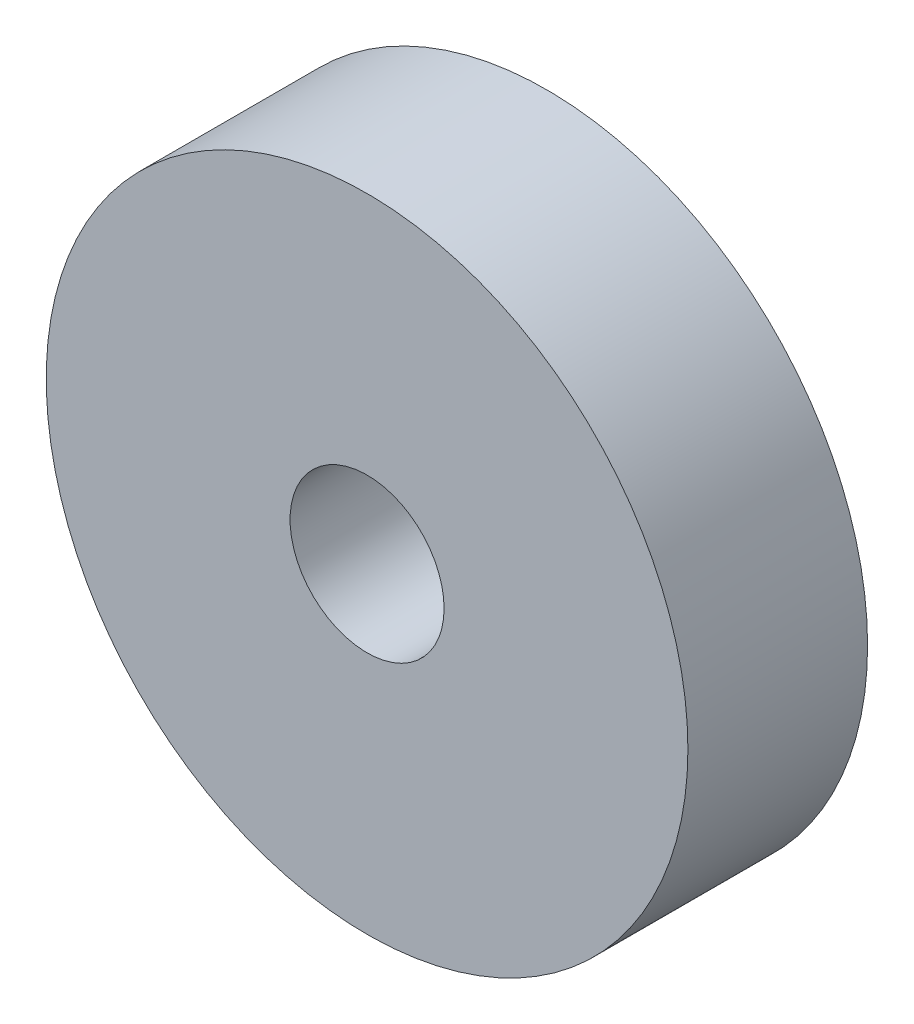
ISO-10303-21;
HEADER;
FILE_DESCRIPTION(('STEP AP214'),'2;1');
FILE_NAME('part.step','',(''),(''),'','','');
FILE_SCHEMA(('AUTOMOTIVE_DESIGN { 1 0 10303 214 1 1 1 1 }'));
ENDSEC;
DATA;
#1=APPLICATION_CONTEXT('core data for automotive mechanical design processes');
#2=APPLICATION_PROTOCOL_DEFINITION('international standard','automotive_design',2000,#1);
#3=PRODUCT_CONTEXT('',#1,'mechanical');
#4=PRODUCT('Part','Part','',(#3));
#5=PRODUCT_RELATED_PRODUCT_CATEGORY('part','',(#4));
#6=PRODUCT_DEFINITION_FORMATION('','',#4);
#7=PRODUCT_DEFINITION_CONTEXT('part definition',#1,'design');
#8=PRODUCT_DEFINITION('design','',#6,#7);
#9=PRODUCT_DEFINITION_SHAPE('','',#8);
#10=(LENGTH_UNIT() NAMED_UNIT(*) SI_UNIT(.MILLI.,.METRE.));
#11=(NAMED_UNIT(*) PLANE_ANGLE_UNIT() SI_UNIT($,.RADIAN.));
#12=(NAMED_UNIT(*) SI_UNIT($,.STERADIAN.) SOLID_ANGLE_UNIT());
#13=UNCERTAINTY_MEASURE_WITH_UNIT(LENGTH_MEASURE(1.E-05),#10,'distance_accuracy_value','');
#14=(GEOMETRIC_REPRESENTATION_CONTEXT(3) GLOBAL_UNCERTAINTY_ASSIGNED_CONTEXT((#13)) GLOBAL_UNIT_ASSIGNED_CONTEXT((#10,
#11,#12)) REPRESENTATION_CONTEXT('',''));
#15=CARTESIAN_POINT('',(0.,0.,0.));
#16=DIRECTION('',(0.,0.,1.));
#17=DIRECTION('',(1.,0.,0.));
#18=AXIS2_PLACEMENT_3D('',#15,#16,#17);
#19=CARTESIAN_POINT('',(0.,0.,7.));
#20=DIRECTION('',(0.,0.,-1.));
#21=DIRECTION('',(-1.,0.,0.));
#22=AXIS2_PLACEMENT_3D('',#19,#20,#21);
#23=CYLINDRICAL_SURFACE('',#22,12.5);
#24=CARTESIAN_POINT('',(0.,0.,7.));
#25=DIRECTION('',(0.,0.,1.));
#26=DIRECTION('',(1.,0.,0.));
#27=AXIS2_PLACEMENT_3D('',#24,#25,#26);
#28=CIRCLE('',#27,12.5);
#29=CARTESIAN_POINT('',(12.5,0.,7.));
#30=VERTEX_POINT('',#29);
#31=EDGE_CURVE('E10',#30,#30,#28,.T.);
#32=ORIENTED_EDGE('',*,*,#31,.F.);
#33=EDGE_LOOP('',(#32));
#34=FACE_BOUND('',#33,.T.);
#35=CARTESIAN_POINT('',(0.,0.,0.));
#36=DIRECTION('',(0.,0.,1.));
#37=DIRECTION('',(1.,0.,0.));
#38=AXIS2_PLACEMENT_3D('',#35,#36,#37);
#39=CIRCLE('',#38,12.5);
#40=CARTESIAN_POINT('',(12.5,0.,0.));
#41=VERTEX_POINT('',#40);
#42=EDGE_CURVE('E38',#41,#41,#39,.T.);
#43=ORIENTED_EDGE('',*,*,#42,.T.);
#44=EDGE_LOOP('',(#43));
#45=FACE_BOUND('',#44,.T.);
#46=ADVANCED_FACE('F35',(#34,#45),#23,.T.);
#47=CARTESIAN_POINT('',(0.,0.,7.));
#48=DIRECTION('',(0.,0.,1.));
#49=DIRECTION('',(1.,0.,0.));
#50=AXIS2_PLACEMENT_3D('',#47,#48,#49);
#51=PLANE('',#50);
#52=CARTESIAN_POINT('',(0.,0.,7.));
#53=DIRECTION('',(0.,0.,1.));
#54=DIRECTION('',(1.,0.,0.));
#55=AXIS2_PLACEMENT_3D('',#52,#53,#54);
#56=CIRCLE('',#55,3.);
#57=CARTESIAN_POINT('',(3.,0.,7.));
#58=VERTEX_POINT('',#57);
#59=EDGE_CURVE('E47',#58,#58,#56,.T.);
#60=ORIENTED_EDGE('',*,*,#59,.F.);
#61=EDGE_LOOP('',(#60));
#62=FACE_BOUND('',#61,.T.);
#63=ORIENTED_EDGE('',*,*,#31,.T.);
#64=EDGE_LOOP('',(#63));
#65=FACE_BOUND('',#64,.T.);
#66=ADVANCED_FACE('F62',(#62,#65),#51,.T.);
#67=CARTESIAN_POINT('',(0.,0.,0.));
#68=DIRECTION('',(0.,0.,1.));
#69=DIRECTION('',(1.,0.,0.));
#70=AXIS2_PLACEMENT_3D('',#67,#68,#69);
#71=PLANE('',#70);
#72=CARTESIAN_POINT('',(0.,0.,0.));
#73=DIRECTION('',(0.,0.,1.));
#74=DIRECTION('',(1.,0.,0.));
#75=AXIS2_PLACEMENT_3D('',#72,#73,#74);
#76=CIRCLE('',#75,3.);
#77=CARTESIAN_POINT('',(3.,0.,0.));
#78=VERTEX_POINT('',#77);
#79=EDGE_CURVE('E45',#78,#78,#76,.T.);
#80=ORIENTED_EDGE('',*,*,#79,.T.);
#81=EDGE_LOOP('',(#80));
#82=FACE_BOUND('',#81,.T.);
#83=ORIENTED_EDGE('',*,*,#42,.F.);
#84=EDGE_LOOP('',(#83));
#85=FACE_BOUND('',#84,.T.);
#86=ADVANCED_FACE('F53',(#82,#85),#71,.F.);
#87=CARTESIAN_POINT('',(0.,0.,0.));
#88=DIRECTION('',(0.,0.,1.));
#89=DIRECTION('',(1.,0.,0.));
#90=AXIS2_PLACEMENT_3D('',#87,#88,#89);
#91=CYLINDRICAL_SURFACE('',#90,3.);
#92=ORIENTED_EDGE('',*,*,#79,.F.);
#93=EDGE_LOOP('',(#92));
#94=FACE_BOUND('',#93,.T.);
#95=ORIENTED_EDGE('',*,*,#59,.T.);
#96=EDGE_LOOP('',(#95));
#97=FACE_BOUND('',#96,.T.);
#98=ADVANCED_FACE('F56',(#94,#97),#91,.F.);
#99=CLOSED_SHELL('',(#46,#66,#86,#98));
#100=MANIFOLD_SOLID_BREP('B2',#99);
#101=ADVANCED_BREP_SHAPE_REPRESENTATION('',(#18,#100),#14);
#102=SHAPE_DEFINITION_REPRESENTATION(#9,#101);
ENDSEC;
END-ISO-10303-21;
